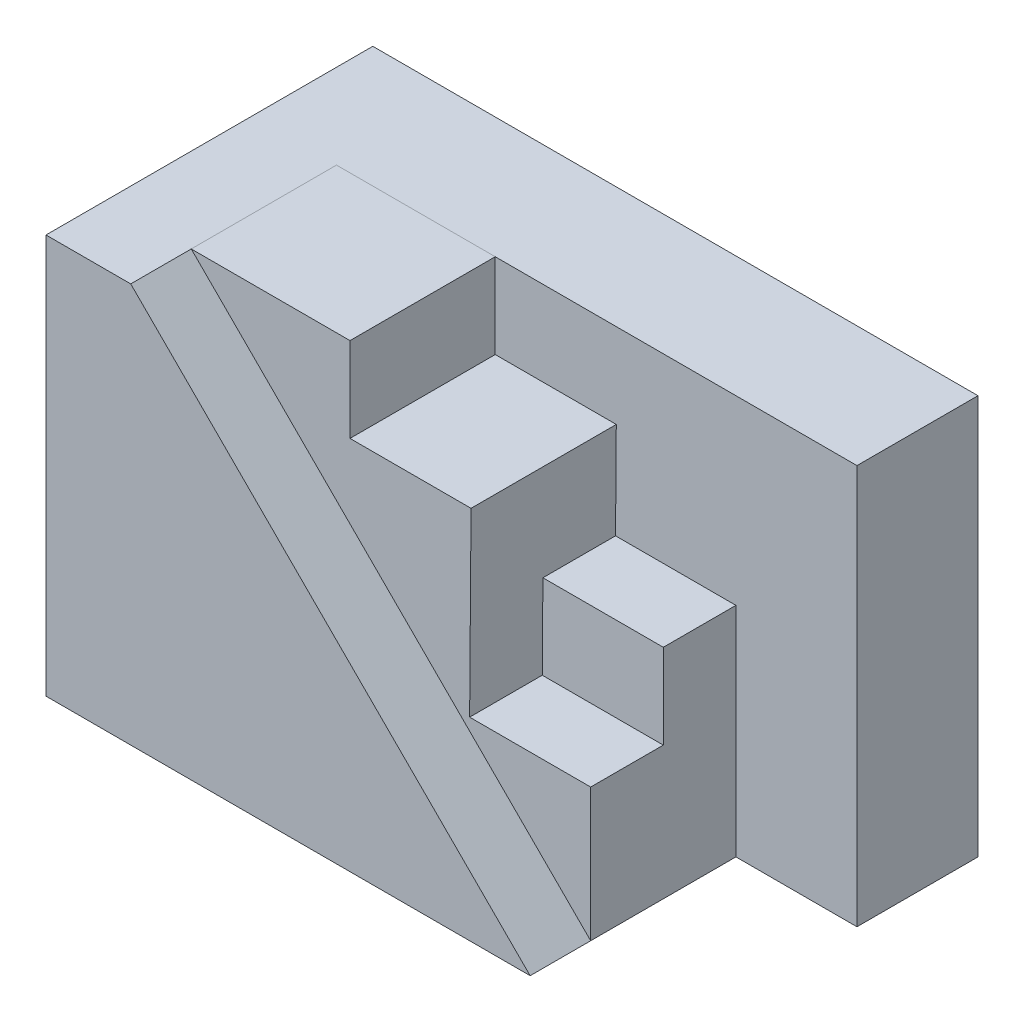
ISO-10303-21;
HEADER;
FILE_DESCRIPTION(('STEP AP214'),'2;1');
FILE_NAME('part.step','',(''),(''),'','','');
FILE_SCHEMA(('AUTOMOTIVE_DESIGN { 1 0 10303 214 1 1 1 1 }'));
ENDSEC;
DATA;
#1=APPLICATION_CONTEXT('core data for automotive mechanical design processes');
#2=APPLICATION_PROTOCOL_DEFINITION('international standard','automotive_design',2000,#1);
#3=PRODUCT_CONTEXT('',#1,'mechanical');
#4=PRODUCT('Part','Part','',(#3));
#5=PRODUCT_RELATED_PRODUCT_CATEGORY('part','',(#4));
#6=PRODUCT_DEFINITION_FORMATION('','',#4);
#7=PRODUCT_DEFINITION_CONTEXT('part definition',#1,'design');
#8=PRODUCT_DEFINITION('design','',#6,#7);
#9=PRODUCT_DEFINITION_SHAPE('','',#8);
#10=(LENGTH_UNIT() NAMED_UNIT(*) SI_UNIT(.MILLI.,.METRE.));
#11=(NAMED_UNIT(*) PLANE_ANGLE_UNIT() SI_UNIT($,.RADIAN.));
#12=(NAMED_UNIT(*) SI_UNIT($,.STERADIAN.) SOLID_ANGLE_UNIT());
#13=UNCERTAINTY_MEASURE_WITH_UNIT(LENGTH_MEASURE(1.E-05),#10,'distance_accuracy_value','');
#14=(GEOMETRIC_REPRESENTATION_CONTEXT(3) GLOBAL_UNCERTAINTY_ASSIGNED_CONTEXT((#13)) GLOBAL_UNIT_ASSIGNED_CONTEXT((#10,
#11,#12)) REPRESENTATION_CONTEXT('',''));
#15=CARTESIAN_POINT('',(0.,0.,0.));
#16=DIRECTION('',(0.,0.,1.));
#17=DIRECTION('',(1.,0.,0.));
#18=AXIS2_PLACEMENT_3D('',#15,#16,#17);
#19=CARTESIAN_POINT('',(20.7956283793361,0.,12.));
#20=DIRECTION('',(-1.,0.,0.));
#21=DIRECTION('',(0.,0.,1.));
#22=AXIS2_PLACEMENT_3D('',#19,#20,#21);
#23=PLANE('',#22);
#24=DIRECTION('',(0.,-1.,0.));
#25=VECTOR('',#24,1.);
#26=CARTESIAN_POINT('',(20.7956283793361,15.8436065870477,0.));
#27=LINE('',#26,#25);
#28=CARTESIAN_POINT('',(20.7956283793361,0.843606587047721,0.));
#29=VERTEX_POINT('',#28);
#30=CARTESIAN_POINT('',(20.7956283793361,-17.1563934129523,0.));
#31=VERTEX_POINT('',#30);
#32=EDGE_CURVE('E165',#29,#31,#27,.T.);
#33=ORIENTED_EDGE('',*,*,#32,.F.);
#34=DIRECTION('',(0.,0.,1.));
#35=VECTOR('',#34,1.);
#36=CARTESIAN_POINT('',(20.7956283793361,0.843606587047721,6.));
#37=LINE('',#36,#35);
#38=CARTESIAN_POINT('',(20.7956283793361,0.843606587047721,6.));
#39=VERTEX_POINT('',#38);
#40=EDGE_CURVE('E376',#29,#39,#37,.T.);
#41=ORIENTED_EDGE('',*,*,#40,.T.);
#42=DIRECTION('',(0.,-1.,0.));
#43=VECTOR('',#42,1.);
#44=CARTESIAN_POINT('',(20.7956283793361,-6.15639341295228,6.));
#45=LINE('',#44,#43);
#46=CARTESIAN_POINT('',(20.7956283793361,-6.15639341295228,6.));
#47=VERTEX_POINT('',#46);
#48=EDGE_CURVE('E180',#39,#47,#45,.T.);
#49=ORIENTED_EDGE('',*,*,#48,.T.);
#50=DIRECTION('',(0.,0.,-1.));
#51=VECTOR('',#50,1.);
#52=CARTESIAN_POINT('',(20.7956283793361,-6.15639341295228,12.));
#53=LINE('',#52,#51);
#54=CARTESIAN_POINT('',(20.7956283793361,-6.15639341295228,12.));
#55=VERTEX_POINT('',#54);
#56=EDGE_CURVE('E328',#55,#47,#53,.T.);
#57=ORIENTED_EDGE('',*,*,#56,.F.);
#58=DIRECTION('',(0.,1.,0.));
#59=VECTOR('',#58,1.);
#60=CARTESIAN_POINT('',(20.7956283793361,0.,12.));
#61=LINE('',#60,#59);
#62=CARTESIAN_POINT('',(20.7956283793361,-17.1563934129523,12.));
#63=VERTEX_POINT('',#62);
#64=EDGE_CURVE('E372',#63,#55,#61,.T.);
#65=ORIENTED_EDGE('',*,*,#64,.F.);
#66=DIRECTION('',(0.,0.,-1.));
#67=VECTOR('',#66,1.);
#68=CARTESIAN_POINT('',(20.7956283793361,-17.1563934129523,12.));
#69=LINE('',#68,#67);
#70=EDGE_CURVE('E55',#63,#31,#69,.T.);
#71=ORIENTED_EDGE('',*,*,#70,.T.);
#72=EDGE_LOOP('',(#33,#41,#49,#57,#65,#71));
#73=FACE_BOUND('',#72,.T.);
#74=ADVANCED_FACE('F38',(#73),#23,.F.);
#75=CARTESIAN_POINT('',(-19.2043716206639,0.,17.));
#76=DIRECTION('',(1.,0.,0.));
#77=DIRECTION('',(0.,1.,0.));
#78=AXIS2_PLACEMENT_3D('',#75,#76,#77);
#79=PLANE('',#78);
#80=DIRECTION('',(0.,0.,-1.));
#81=VECTOR('',#80,1.);
#82=CARTESIAN_POINT('',(-19.2043716206639,15.8436065870477,17.));
#83=LINE('',#82,#81);
#84=CARTESIAN_POINT('',(-19.2043716206639,15.8436065870477,17.));
#85=VERTEX_POINT('',#84);
#86=CARTESIAN_POINT('',(-19.2043716206639,15.8436065870477,-10.));
#87=VERTEX_POINT('',#86);
#88=EDGE_CURVE('E252',#85,#87,#83,.T.);
#89=ORIENTED_EDGE('',*,*,#88,.T.);
#90=DIRECTION('',(0.,-1.,0.));
#91=VECTOR('',#90,1.);
#92=CARTESIAN_POINT('',(-19.2043716206639,-17.1563934129523,-10.));
#93=LINE('',#92,#91);
#94=CARTESIAN_POINT('',(-19.2043716206639,-17.1563934129523,-10.));
#95=VERTEX_POINT('',#94);
#96=EDGE_CURVE('E177',#87,#95,#93,.T.);
#97=ORIENTED_EDGE('',*,*,#96,.T.);
#98=DIRECTION('',(0.,0.,-1.));
#99=VECTOR('',#98,1.);
#100=CARTESIAN_POINT('',(-19.2043716206639,-17.1563934129523,17.));
#101=LINE('',#100,#99);
#102=CARTESIAN_POINT('',(-19.2043716206639,-17.1563934129523,17.));
#103=VERTEX_POINT('',#102);
#104=EDGE_CURVE('E344',#103,#95,#101,.T.);
#105=ORIENTED_EDGE('',*,*,#104,.F.);
#106=DIRECTION('',(0.,-1.,0.));
#107=VECTOR('',#106,1.);
#108=CARTESIAN_POINT('',(-19.2043716206639,0.,17.));
#109=LINE('',#108,#107);
#110=EDGE_CURVE('E300',#85,#103,#109,.T.);
#111=ORIENTED_EDGE('',*,*,#110,.F.);
#112=EDGE_LOOP('',(#89,#97,#105,#111));
#113=FACE_BOUND('',#112,.T.);
#114=ADVANCED_FACE('F40',(#113),#79,.F.);
#115=CARTESIAN_POINT('',(0.,-17.1563934129523,17.));
#116=DIRECTION('',(0.,1.,0.));
#117=DIRECTION('',(0.,0.,1.));
#118=AXIS2_PLACEMENT_3D('',#115,#116,#117);
#119=PLANE('',#118);
#120=ORIENTED_EDGE('',*,*,#104,.T.);
#121=DIRECTION('',(1.,0.,0.));
#122=VECTOR('',#121,1.);
#123=CARTESIAN_POINT('',(-53.6862509197972,-17.1563934129523,-10.));
#124=LINE('',#123,#122);
#125=CARTESIAN_POINT('',(30.7956283793361,-17.1563934129523,-10.));
#126=VERTEX_POINT('',#125);
#127=EDGE_CURVE('E151',#95,#126,#124,.T.);
#128=ORIENTED_EDGE('',*,*,#127,.T.);
#129=DIRECTION('',(0.,0.,-1.));
#130=VECTOR('',#129,1.);
#131=CARTESIAN_POINT('',(30.7956283793361,-17.1563934129523,0.));
#132=LINE('',#131,#130);
#133=CARTESIAN_POINT('',(30.7956283793361,-17.1563934129523,0.));
#134=VERTEX_POINT('',#133);
#135=EDGE_CURVE('E145',#134,#126,#132,.T.);
#136=ORIENTED_EDGE('',*,*,#135,.F.);
#137=DIRECTION('',(-1.,0.,0.));
#138=VECTOR('',#137,1.);
#139=CARTESIAN_POINT('',(30.7956283793361,-17.1563934129523,0.));
#140=LINE('',#139,#138);
#141=EDGE_CURVE('E149',#134,#31,#140,.T.);
#142=ORIENTED_EDGE('',*,*,#141,.T.);
#143=ORIENTED_EDGE('',*,*,#70,.F.);
#144=DIRECTION('',(0.,0.,-1.));
#145=VECTOR('',#144,1.);
#146=CARTESIAN_POINT('',(20.7956283793361,-17.1563934129523,17.));
#147=LINE('',#146,#145);
#148=CARTESIAN_POINT('',(20.7956283793361,-17.1563934129523,17.));
#149=VERTEX_POINT('',#148);
#150=EDGE_CURVE('E342',#149,#63,#147,.T.);
#151=ORIENTED_EDGE('',*,*,#150,.F.);
#152=DIRECTION('',(1.,0.,0.));
#153=VECTOR('',#152,1.);
#154=CARTESIAN_POINT('',(0.,-17.1563934129523,17.));
#155=LINE('',#154,#153);
#156=EDGE_CURVE('E334',#103,#149,#155,.T.);
#157=ORIENTED_EDGE('',*,*,#156,.F.);
#158=EDGE_LOOP('',(#120,#128,#136,#142,#143,#151,#157));
#159=FACE_BOUND('',#158,.T.);
#160=ADVANCED_FACE('F147',(#159),#119,.F.);
#161=CARTESIAN_POINT('',(1.81961748319191,1.81961748319191,17.));
#162=DIRECTION('',(0.707106781186547,0.707106781186548,0.));
#163=DIRECTION('',(-0.707106781186548,0.707106781186547,0.));
#164=AXIS2_PLACEMENT_3D('',#161,#162,#163);
#165=PLANE('',#164);
#166=DIRECTION('',(0.707106781186548,-0.707106781186547,0.));
#167=VECTOR('',#166,1.);
#168=CARTESIAN_POINT('',(1.81961748319191,1.81961748319191,12.));
#169=LINE('',#168,#167);
#170=CARTESIAN_POINT('',(-12.2043716206639,15.8436065870477,12.));
#171=VERTEX_POINT('',#170);
#172=EDGE_CURVE('E369',#171,#63,#169,.T.);
#173=ORIENTED_EDGE('',*,*,#172,.F.);
#174=DIRECTION('',(0.,0.,-1.));
#175=VECTOR('',#174,1.);
#176=CARTESIAN_POINT('',(-12.2043716206639,15.8436065870477,17.));
#177=LINE('',#176,#175);
#178=CARTESIAN_POINT('',(-12.2043716206639,15.8436065870477,17.));
#179=VERTEX_POINT('',#178);
#180=EDGE_CURVE('E254',#179,#171,#177,.T.);
#181=ORIENTED_EDGE('',*,*,#180,.F.);
#182=DIRECTION('',(0.707106781186548,-0.707106781186547,0.));
#183=VECTOR('',#182,1.);
#184=CARTESIAN_POINT('',(1.81961748319191,1.81961748319191,17.));
#185=LINE('',#184,#183);
#186=EDGE_CURVE('E336',#179,#149,#185,.T.);
#187=ORIENTED_EDGE('',*,*,#186,.T.);
#188=ORIENTED_EDGE('',*,*,#150,.T.);
#189=EDGE_LOOP('',(#173,#181,#187,#188));
#190=FACE_BOUND('',#189,.T.);
#191=ADVANCED_FACE('F277',(#190),#165,.T.);
#192=CARTESIAN_POINT('',(0.,15.8436065870477,17.));
#193=DIRECTION('',(0.,1.,0.));
#194=DIRECTION('',(0.,0.,1.));
#195=AXIS2_PLACEMENT_3D('',#192,#193,#194);
#196=PLANE('',#195);
#197=DIRECTION('',(0.,0.,-1.));
#198=VECTOR('',#197,1.);
#199=CARTESIAN_POINT('',(-12.2043716206639,15.8436065870477,12.));
#200=LINE('',#199,#198);
#201=CARTESIAN_POINT('',(-12.2043716206639,15.8436065870477,0.));
#202=VERTEX_POINT('',#201);
#203=EDGE_CURVE('E231',#171,#202,#200,.T.);
#204=ORIENTED_EDGE('',*,*,#203,.T.);
#205=CARTESIAN_POINT('',(-12.2043716206639,15.8436065870477,0.));
#206=DIRECTION('',(1.,0.,0.));
#207=VECTOR('',#206,1.);
#208=LINE('',#205,#207);
#209=CARTESIAN_POINT('',(0.911243772384288,15.8442898807603,0.));
#210=VERTEX_POINT('',#209);
#211=EDGE_CURVE('E248',#202,#210,#208,.T.);
#212=ORIENTED_EDGE('',*,*,#211,.T.);
#213=CARTESIAN_POINT('',(0.911243772384288,15.8436065870477,0.));
#214=DIRECTION('',(1.,0.,0.));
#215=VECTOR('',#214,1.);
#216=LINE('',#213,#215);
#217=CARTESIAN_POINT('',(20.7956283793361,15.8436065870477,0.));
#218=VERTEX_POINT('',#217);
#219=EDGE_CURVE('E181',#210,#218,#216,.T.);
#220=ORIENTED_EDGE('',*,*,#219,.T.);
#221=DIRECTION('',(-1.,0.,0.));
#222=VECTOR('',#221,1.);
#223=CARTESIAN_POINT('',(30.7956283793361,15.8436065870477,0.));
#224=LINE('',#223,#222);
#225=CARTESIAN_POINT('',(30.7956283793361,15.8436065870477,0.));
#226=VERTEX_POINT('',#225);
#227=EDGE_CURVE('E170',#226,#218,#224,.T.);
#228=ORIENTED_EDGE('',*,*,#227,.F.);
#229=DIRECTION('',(0.,0.,1.));
#230=VECTOR('',#229,1.);
#231=CARTESIAN_POINT('',(30.7956283793361,15.8436065870477,0.));
#232=LINE('',#231,#230);
#233=CARTESIAN_POINT('',(30.7956283793361,15.8436065870477,-10.));
#234=VERTEX_POINT('',#233);
#235=EDGE_CURVE('E161',#234,#226,#232,.T.);
#236=ORIENTED_EDGE('',*,*,#235,.F.);
#237=DIRECTION('',(1.,0.,0.));
#238=VECTOR('',#237,1.);
#239=CARTESIAN_POINT('',(-53.6862509197972,15.8436065870477,-10.));
#240=LINE('',#239,#238);
#241=EDGE_CURVE('E172',#87,#234,#240,.T.);
#242=ORIENTED_EDGE('',*,*,#241,.F.);
#243=ORIENTED_EDGE('',*,*,#88,.F.);
#244=DIRECTION('',(1.,0.,0.));
#245=VECTOR('',#244,1.);
#246=CARTESIAN_POINT('',(0.,15.8436065870477,17.));
#247=LINE('',#246,#245);
#248=EDGE_CURVE('E255',#85,#179,#247,.T.);
#249=ORIENTED_EDGE('',*,*,#248,.T.);
#250=ORIENTED_EDGE('',*,*,#180,.T.);
#251=EDGE_LOOP('',(#204,#212,#220,#228,#236,#242,#243,#249,#250));
#252=FACE_BOUND('',#251,.T.);
#253=ADVANCED_FACE('F266',(#252),#196,.T.);
#254=CARTESIAN_POINT('',(0.,0.,17.));
#255=DIRECTION('',(0.,0.,1.));
#256=DIRECTION('',(1.,0.,0.));
#257=AXIS2_PLACEMENT_3D('',#254,#255,#256);
#258=PLANE('',#257);
#259=ORIENTED_EDGE('',*,*,#110,.T.);
#260=ORIENTED_EDGE('',*,*,#156,.T.);
#261=ORIENTED_EDGE('',*,*,#186,.F.);
#262=ORIENTED_EDGE('',*,*,#248,.F.);
#263=EDGE_LOOP('',(#259,#260,#261,#262));
#264=FACE_BOUND('',#263,.T.);
#265=ADVANCED_FACE('F276',(#264),#258,.T.);
#266=CARTESIAN_POINT('',(10.8424316306612,-0.0835625199392023,12.));
#267=DIRECTION('',(0.999970302470003,-0.00770676183951775,0.));
#268=DIRECTION('',(0.00770676183951775,0.999970302470003,0.));
#269=AXIS2_PLACEMENT_3D('',#266,#267,#268);
#270=PLANE('',#269);
#271=DIRECTION('',(-0.00770676183951775,-0.999970302470003,0.));
#272=VECTOR('',#271,1.);
#273=CARTESIAN_POINT('',(10.8424316306612,-0.0835625199392023,6.));
#274=LINE('',#273,#272);
#275=CARTESIAN_POINT('',(10.8495773143628,0.843606587047721,6.));
#276=VERTEX_POINT('',#275);
#277=CARTESIAN_POINT('',(10.7956283793361,-6.15639341295228,6.));
#278=VERTEX_POINT('',#277);
#279=EDGE_CURVE('E63',#276,#278,#274,.T.);
#280=ORIENTED_EDGE('',*,*,#279,.F.);
#281=DIRECTION('',(0.,0.,1.));
#282=VECTOR('',#281,1.);
#283=CARTESIAN_POINT('',(10.8495773143628,0.843606587047721,12.));
#284=LINE('',#283,#282);
#285=CARTESIAN_POINT('',(10.8495773143628,0.843606587047721,0.));
#286=VERTEX_POINT('',#285);
#287=EDGE_CURVE('E11',#286,#276,#284,.T.);
#288=ORIENTED_EDGE('',*,*,#287,.F.);
#289=DIRECTION('',(-0.00770676183951775,-0.999970302470003,0.));
#290=VECTOR('',#289,1.);
#291=CARTESIAN_POINT('',(10.8424316306612,-0.0835625199392023,0.));
#292=LINE('',#291,#290);
#293=CARTESIAN_POINT('',(10.9112437723843,8.84497317447278,0.));
#294=VERTEX_POINT('',#293);
#295=EDGE_CURVE('E321',#294,#286,#292,.T.);
#296=ORIENTED_EDGE('',*,*,#295,.F.);
#297=DIRECTION('',(0.,0.,-1.));
#298=VECTOR('',#297,1.);
#299=CARTESIAN_POINT('',(10.9112437723843,8.84497317447278,12.));
#300=LINE('',#299,#298);
#301=CARTESIAN_POINT('',(10.9112437723843,8.84497317447278,12.));
#302=VERTEX_POINT('',#301);
#303=EDGE_CURVE('E317',#302,#294,#300,.T.);
#304=ORIENTED_EDGE('',*,*,#303,.F.);
#305=DIRECTION('',(-0.00770676183951775,-0.999970302470003,0.));
#306=VECTOR('',#305,1.);
#307=CARTESIAN_POINT('',(10.8424316306612,-0.0835625199392023,12.));
#308=LINE('',#307,#306);
#309=CARTESIAN_POINT('',(10.7956283793361,-6.15639341295228,12.));
#310=VERTEX_POINT('',#309);
#311=EDGE_CURVE('E355',#302,#310,#308,.T.);
#312=ORIENTED_EDGE('',*,*,#311,.T.);
#313=DIRECTION('',(0.,0.,-1.));
#314=VECTOR('',#313,1.);
#315=CARTESIAN_POINT('',(10.7956283793361,-6.15639341295228,12.));
#316=LINE('',#315,#314);
#317=EDGE_CURVE('E326',#310,#278,#316,.T.);
#318=ORIENTED_EDGE('',*,*,#317,.T.);
#319=EDGE_LOOP('',(#280,#288,#296,#304,#312,#318));
#320=FACE_BOUND('',#319,.T.);
#321=ADVANCED_FACE('F353',(#320),#270,.T.);
#322=CARTESIAN_POINT('',(0.,8.84497317447278,12.));
#323=DIRECTION('',(0.,1.,0.));
#324=DIRECTION('',(0.,0.,1.));
#325=AXIS2_PLACEMENT_3D('',#322,#323,#324);
#326=PLANE('',#325);
#327=DIRECTION('',(1.,0.,0.));
#328=VECTOR('',#327,1.);
#329=CARTESIAN_POINT('',(0.,8.84497317447278,0.));
#330=LINE('',#329,#328);
#331=CARTESIAN_POINT('',(0.911243772384288,8.84497317447278,0.));
#332=VERTEX_POINT('',#331);
#333=EDGE_CURVE('E249',#332,#294,#330,.T.);
#334=ORIENTED_EDGE('',*,*,#333,.F.);
#335=DIRECTION('',(0.,0.,-1.));
#336=VECTOR('',#335,1.);
#337=CARTESIAN_POINT('',(0.911243772384288,8.84497317447278,12.));
#338=LINE('',#337,#336);
#339=CARTESIAN_POINT('',(0.911243772384288,8.84497317447278,12.));
#340=VERTEX_POINT('',#339);
#341=EDGE_CURVE('E242',#340,#332,#338,.T.);
#342=ORIENTED_EDGE('',*,*,#341,.F.);
#343=DIRECTION('',(1.,0.,0.));
#344=VECTOR('',#343,1.);
#345=CARTESIAN_POINT('',(0.,8.84497317447278,12.));
#346=LINE('',#345,#344);
#347=EDGE_CURVE('E364',#340,#302,#346,.T.);
#348=ORIENTED_EDGE('',*,*,#347,.T.);
#349=ORIENTED_EDGE('',*,*,#303,.T.);
#350=EDGE_LOOP('',(#334,#342,#348,#349));
#351=FACE_BOUND('',#350,.T.);
#352=ADVANCED_FACE('F320',(#351),#326,.T.);
#353=CARTESIAN_POINT('',(0.911243772384288,0.,12.));
#354=DIRECTION('',(-1.,0.,0.));
#355=DIRECTION('',(0.,0.,1.));
#356=AXIS2_PLACEMENT_3D('',#353,#354,#355);
#357=PLANE('',#356);
#358=DIRECTION('',(0.,1.,0.));
#359=VECTOR('',#358,1.);
#360=CARTESIAN_POINT('',(0.911243772384288,0.,0.));
#361=LINE('',#360,#359);
#362=EDGE_CURVE('E245',#332,#210,#361,.T.);
#363=ORIENTED_EDGE('',*,*,#362,.T.);
#364=DIRECTION('',(0.,0.,-1.));
#365=VECTOR('',#364,1.);
#366=CARTESIAN_POINT('',(0.911243772384288,15.8449731744728,12.));
#367=LINE('',#366,#365);
#368=CARTESIAN_POINT('',(0.911243772384288,15.8449731744728,12.));
#369=VERTEX_POINT('',#368);
#370=EDGE_CURVE('E238',#369,#210,#367,.T.);
#371=ORIENTED_EDGE('',*,*,#370,.F.);
#372=DIRECTION('',(0.,1.,0.));
#373=VECTOR('',#372,1.);
#374=CARTESIAN_POINT('',(0.911243772384288,0.,12.));
#375=LINE('',#374,#373);
#376=EDGE_CURVE('E313',#340,#369,#375,.T.);
#377=ORIENTED_EDGE('',*,*,#376,.F.);
#378=ORIENTED_EDGE('',*,*,#341,.T.);
#379=EDGE_LOOP('',(#363,#371,#377,#378));
#380=FACE_BOUND('',#379,.T.);
#381=ADVANCED_FACE('F222',(#380),#357,.F.);
#382=CARTESIAN_POINT('',(-0.00165096417152977,15.8448780549965,12.));
#383=DIRECTION('',(-0.000104195447692143,0.999999994571654,0.));
#384=DIRECTION('',(-0.999999994571654,-0.000104195447692143,0.));
#385=AXIS2_PLACEMENT_3D('',#382,#383,#384);
#386=PLANE('',#385);
#387=ORIENTED_EDGE('',*,*,#211,.F.);
#388=ORIENTED_EDGE('',*,*,#203,.F.);
#389=DIRECTION('',(0.999999994571654,0.000104195447692143,0.));
#390=VECTOR('',#389,1.);
#391=CARTESIAN_POINT('',(-0.00165096417152977,15.8448780549965,12.));
#392=LINE('',#391,#390);
#393=EDGE_CURVE('E367',#171,#369,#392,.T.);
#394=ORIENTED_EDGE('',*,*,#393,.T.);
#395=ORIENTED_EDGE('',*,*,#370,.T.);
#396=EDGE_LOOP('',(#387,#388,#394,#395));
#397=FACE_BOUND('',#396,.T.);
#398=ADVANCED_FACE('F215',(#397),#386,.T.);
#399=CARTESIAN_POINT('',(0.,-6.15639341295228,12.));
#400=DIRECTION('',(0.,-1.,0.));
#401=DIRECTION('',(1.,0.,0.));
#402=AXIS2_PLACEMENT_3D('',#399,#400,#401);
#403=PLANE('',#402);
#404=ORIENTED_EDGE('',*,*,#56,.T.);
#405=DIRECTION('',(-1.,0.,0.));
#406=VECTOR('',#405,1.);
#407=CARTESIAN_POINT('',(0.,-6.15639341295228,6.));
#408=LINE('',#407,#406);
#409=EDGE_CURVE('E47',#47,#278,#408,.T.);
#410=ORIENTED_EDGE('',*,*,#409,.T.);
#411=ORIENTED_EDGE('',*,*,#317,.F.);
#412=DIRECTION('',(-1.,0.,0.));
#413=VECTOR('',#412,1.);
#414=CARTESIAN_POINT('',(0.,-6.15639341295228,12.));
#415=LINE('',#414,#413);
#416=EDGE_CURVE('E329',#55,#310,#415,.T.);
#417=ORIENTED_EDGE('',*,*,#416,.F.);
#418=EDGE_LOOP('',(#404,#410,#411,#417));
#419=FACE_BOUND('',#418,.T.);
#420=ADVANCED_FACE('F211',(#419),#403,.F.);
#421=CARTESIAN_POINT('',(0.,0.,12.));
#422=DIRECTION('',(0.,0.,1.));
#423=DIRECTION('',(1.,0.,0.));
#424=AXIS2_PLACEMENT_3D('',#421,#422,#423);
#425=PLANE('',#424);
#426=ORIENTED_EDGE('',*,*,#311,.F.);
#427=ORIENTED_EDGE('',*,*,#347,.F.);
#428=ORIENTED_EDGE('',*,*,#376,.T.);
#429=ORIENTED_EDGE('',*,*,#393,.F.);
#430=ORIENTED_EDGE('',*,*,#172,.T.);
#431=ORIENTED_EDGE('',*,*,#64,.T.);
#432=ORIENTED_EDGE('',*,*,#416,.T.);
#433=EDGE_LOOP('',(#426,#427,#428,#429,#430,#431,#432));
#434=FACE_BOUND('',#433,.T.);
#435=ADVANCED_FACE('F207',(#434),#425,.T.);
#436=CARTESIAN_POINT('',(8.7956283793361,-6.15639341295228,6.));
#437=DIRECTION('',(0.,0.,1.));
#438=DIRECTION('',(1.,0.,0.));
#439=AXIS2_PLACEMENT_3D('',#436,#437,#438);
#440=PLANE('',#439);
#441=DIRECTION('',(1.,0.,0.));
#442=VECTOR('',#441,1.);
#443=CARTESIAN_POINT('',(8.7956283793361,0.843606587047721,6.));
#444=LINE('',#443,#442);
#445=EDGE_CURVE('E357',#276,#39,#444,.T.);
#446=ORIENTED_EDGE('',*,*,#445,.F.);
#447=ORIENTED_EDGE('',*,*,#279,.T.);
#448=ORIENTED_EDGE('',*,*,#409,.F.);
#449=ORIENTED_EDGE('',*,*,#48,.F.);
#450=EDGE_LOOP('',(#446,#447,#448,#449));
#451=FACE_BOUND('',#450,.T.);
#452=ADVANCED_FACE('F203',(#451),#440,.T.);
#453=CARTESIAN_POINT('',(8.7956283793361,0.843606587047721,6.));
#454=DIRECTION('',(0.,1.,0.));
#455=DIRECTION('',(0.,0.,1.));
#456=AXIS2_PLACEMENT_3D('',#453,#454,#455);
#457=PLANE('',#456);
#458=DIRECTION('',(1.,0.,0.));
#459=VECTOR('',#458,1.);
#460=CARTESIAN_POINT('',(8.7956283793361,0.843606587047721,0.));
#461=LINE('',#460,#459);
#462=EDGE_CURVE('E359',#286,#29,#461,.T.);
#463=ORIENTED_EDGE('',*,*,#462,.F.);
#464=ORIENTED_EDGE('',*,*,#287,.T.);
#465=ORIENTED_EDGE('',*,*,#445,.T.);
#466=ORIENTED_EDGE('',*,*,#40,.F.);
#467=EDGE_LOOP('',(#463,#464,#465,#466));
#468=FACE_BOUND('',#467,.T.);
#469=ADVANCED_FACE('F199',(#468),#457,.T.);
#470=CARTESIAN_POINT('',(-53.6862509197972,-17.1563934129523,0.));
#471=DIRECTION('',(0.,0.,1.));
#472=DIRECTION('',(1.,0.,0.));
#473=AXIS2_PLACEMENT_3D('',#470,#471,#472);
#474=PLANE('',#473);
#475=ORIENTED_EDGE('',*,*,#295,.T.);
#476=ORIENTED_EDGE('',*,*,#462,.T.);
#477=ORIENTED_EDGE('',*,*,#32,.T.);
#478=ORIENTED_EDGE('',*,*,#141,.F.);
#479=DIRECTION('',(0.,-1.,0.));
#480=VECTOR('',#479,1.);
#481=CARTESIAN_POINT('',(30.7956283793361,15.8436065870477,0.));
#482=LINE('',#481,#480);
#483=EDGE_CURVE('E156',#226,#134,#482,.T.);
#484=ORIENTED_EDGE('',*,*,#483,.F.);
#485=ORIENTED_EDGE('',*,*,#227,.T.);
#486=ORIENTED_EDGE('',*,*,#219,.F.);
#487=ORIENTED_EDGE('',*,*,#362,.F.);
#488=ORIENTED_EDGE('',*,*,#333,.T.);
#489=EDGE_LOOP('',(#475,#476,#477,#478,#484,#485,#486,#487,#488));
#490=FACE_BOUND('',#489,.T.);
#491=ADVANCED_FACE('F168',(#490),#474,.T.);
#492=CARTESIAN_POINT('',(-53.6862509197972,-17.1563934129523,-10.));
#493=DIRECTION('',(0.,0.,-1.));
#494=DIRECTION('',(-1.,0.,0.));
#495=AXIS2_PLACEMENT_3D('',#492,#493,#494);
#496=PLANE('',#495);
#497=ORIENTED_EDGE('',*,*,#96,.F.);
#498=ORIENTED_EDGE('',*,*,#241,.T.);
#499=DIRECTION('',(0.,1.,0.));
#500=VECTOR('',#499,1.);
#501=CARTESIAN_POINT('',(30.7956283793361,15.8436065870477,-10.));
#502=LINE('',#501,#500);
#503=EDGE_CURVE('E155',#126,#234,#502,.T.);
#504=ORIENTED_EDGE('',*,*,#503,.F.);
#505=ORIENTED_EDGE('',*,*,#127,.F.);
#506=EDGE_LOOP('',(#497,#498,#504,#505));
#507=FACE_BOUND('',#506,.T.);
#508=ADVANCED_FACE('F198',(#507),#496,.T.);
#509=CARTESIAN_POINT('',(30.7956283793361,0.,0.));
#510=DIRECTION('',(1.,0.,0.));
#511=DIRECTION('',(0.,0.,-1.));
#512=AXIS2_PLACEMENT_3D('',#509,#510,#511);
#513=PLANE('',#512);
#514=ORIENTED_EDGE('',*,*,#483,.T.);
#515=ORIENTED_EDGE('',*,*,#135,.T.);
#516=ORIENTED_EDGE('',*,*,#503,.T.);
#517=ORIENTED_EDGE('',*,*,#235,.T.);
#518=EDGE_LOOP('',(#514,#515,#516,#517));
#519=FACE_BOUND('',#518,.T.);
#520=ADVANCED_FACE('F159',(#519),#513,.T.);
#521=CLOSED_SHELL('',(#74,#114,#160,#191,#253,#265,#321,#352,#381,#398,#420,#435,#452,#469,#491,
#508,#520));
#522=MANIFOLD_SOLID_BREP('B2',#521);
#523=ADVANCED_BREP_SHAPE_REPRESENTATION('',(#18,#522),#14);
#524=SHAPE_DEFINITION_REPRESENTATION(#9,#523);
ENDSEC;
END-ISO-10303-21;
